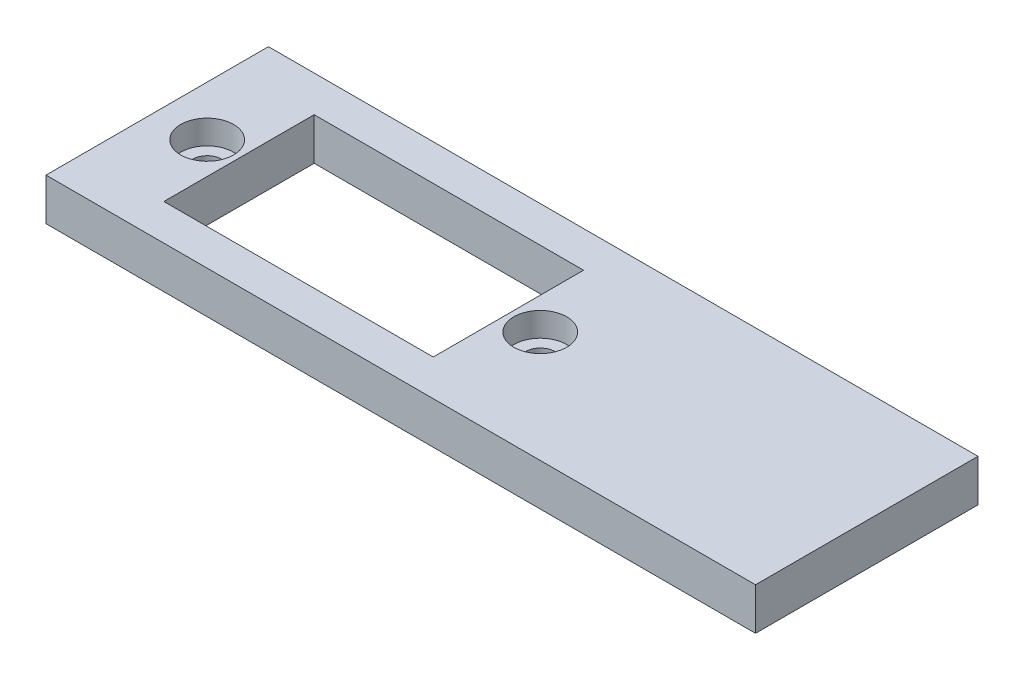
ISO-10303-21;
HEADER;
FILE_DESCRIPTION(('STEP AP214'),'2;1');
FILE_NAME('part.step','',(''),(''),'','','');
FILE_SCHEMA(('AUTOMOTIVE_DESIGN { 1 0 10303 214 1 1 1 1 }'));
ENDSEC;
DATA;
#1=APPLICATION_CONTEXT('core data for automotive mechanical design processes');
#2=APPLICATION_PROTOCOL_DEFINITION('international standard','automotive_design',2000,#1);
#3=PRODUCT_CONTEXT('',#1,'mechanical');
#4=PRODUCT('Part','Part','',(#3));
#5=PRODUCT_RELATED_PRODUCT_CATEGORY('part','',(#4));
#6=PRODUCT_DEFINITION_FORMATION('','',#4);
#7=PRODUCT_DEFINITION_CONTEXT('part definition',#1,'design');
#8=PRODUCT_DEFINITION('design','',#6,#7);
#9=PRODUCT_DEFINITION_SHAPE('','',#8);
#10=(LENGTH_UNIT() NAMED_UNIT(*) SI_UNIT(.MILLI.,.METRE.));
#11=(NAMED_UNIT(*) PLANE_ANGLE_UNIT() SI_UNIT($,.RADIAN.));
#12=(NAMED_UNIT(*) SI_UNIT($,.STERADIAN.) SOLID_ANGLE_UNIT());
#13=UNCERTAINTY_MEASURE_WITH_UNIT(LENGTH_MEASURE(1.E-05),#10,'distance_accuracy_value','');
#14=(GEOMETRIC_REPRESENTATION_CONTEXT(3) GLOBAL_UNCERTAINTY_ASSIGNED_CONTEXT((#13)) GLOBAL_UNIT_ASSIGNED_CONTEXT((#10,
#11,#12)) REPRESENTATION_CONTEXT('',''));
#15=CARTESIAN_POINT('',(0.,0.,0.));
#16=DIRECTION('',(0.,0.,1.));
#17=DIRECTION('',(1.,0.,0.));
#18=AXIS2_PLACEMENT_3D('',#15,#16,#17);
#19=CARTESIAN_POINT('',(0.,3.5,0.));
#20=DIRECTION('',(0.,-1.,0.));
#21=DIRECTION('',(0.,0.,-1.));
#22=AXIS2_PLACEMENT_3D('',#19,#20,#21);
#23=PLANE('',#22);
#24=CARTESIAN_POINT('',(-31.85,3.5,0.));
#25=DIRECTION('',(0.,1.,0.));
#26=DIRECTION('',(0.,0.,1.));
#27=AXIS2_PLACEMENT_3D('',#24,#25,#26);
#28=CIRCLE('',#27,2.19999999999999);
#29=CARTESIAN_POINT('',(-31.85,3.5,2.19999999999999));
#30=VERTEX_POINT('',#29);
#31=EDGE_CURVE('E248',#30,#30,#28,.T.);
#32=ORIENTED_EDGE('',*,*,#31,.F.);
#33=EDGE_LOOP('',(#32));
#34=FACE_BOUND('',#33,.T.);
#35=DIRECTION('',(0.,0.,-1.));
#36=VECTOR('',#35,1.);
#37=CARTESIAN_POINT('',(23.,3.5,9.25));
#38=LINE('',#37,#36);
#39=CARTESIAN_POINT('',(23.,3.5,9.25));
#40=VERTEX_POINT('',#39);
#41=CARTESIAN_POINT('',(23.,3.5,-9.25));
#42=VERTEX_POINT('',#41);
#43=EDGE_CURVE('E139',#40,#42,#38,.T.);
#44=ORIENTED_EDGE('',*,*,#43,.T.);
#45=DIRECTION('',(-1.,0.,0.));
#46=VECTOR('',#45,1.);
#47=CARTESIAN_POINT('',(0.,3.5,-9.25));
#48=LINE('',#47,#46);
#49=CARTESIAN_POINT('',(-36.,3.5,-9.25));
#50=VERTEX_POINT('',#49);
#51=EDGE_CURVE('E142',#42,#50,#48,.T.);
#52=ORIENTED_EDGE('',*,*,#51,.T.);
#53=DIRECTION('',(0.,0.,1.));
#54=VECTOR('',#53,1.);
#55=CARTESIAN_POINT('',(-36.,3.5,9.25));
#56=LINE('',#55,#54);
#57=CARTESIAN_POINT('',(-36.,3.5,9.25));
#58=VERTEX_POINT('',#57);
#59=EDGE_CURVE('E145',#50,#58,#56,.T.);
#60=ORIENTED_EDGE('',*,*,#59,.T.);
#61=DIRECTION('',(1.,0.,0.));
#62=VECTOR('',#61,1.);
#63=CARTESIAN_POINT('',(-36.,3.5,9.25));
#64=LINE('',#63,#62);
#65=EDGE_CURVE('E147',#58,#40,#64,.T.);
#66=ORIENTED_EDGE('',*,*,#65,.T.);
#67=EDGE_LOOP('',(#44,#52,#60,#66));
#68=FACE_BOUND('',#67,.T.);
#69=DIRECTION('',(0.,0.,1.));
#70=VECTOR('',#69,1.);
#71=CARTESIAN_POINT('',(-29.2,3.5,-6.25));
#72=LINE('',#71,#70);
#73=CARTESIAN_POINT('',(-29.2,3.5,-6.25));
#74=VERTEX_POINT('',#73);
#75=CARTESIAN_POINT('',(-29.2,3.5,6.25));
#76=VERTEX_POINT('',#75);
#77=EDGE_CURVE('E100',#74,#76,#72,.T.);
#78=ORIENTED_EDGE('',*,*,#77,.F.);
#79=DIRECTION('',(-1.,0.,0.));
#80=VECTOR('',#79,1.);
#81=CARTESIAN_POINT('',(-6.8,3.5,-6.25));
#82=LINE('',#81,#80);
#83=CARTESIAN_POINT('',(-6.8,3.5,-6.25));
#84=VERTEX_POINT('',#83);
#85=EDGE_CURVE('E123',#84,#74,#82,.T.);
#86=ORIENTED_EDGE('',*,*,#85,.F.);
#87=DIRECTION('',(0.,0.,-1.));
#88=VECTOR('',#87,1.);
#89=CARTESIAN_POINT('',(-6.8,3.5,-6.25));
#90=LINE('',#89,#88);
#91=CARTESIAN_POINT('',(-6.79999999999999,3.5,6.25));
#92=VERTEX_POINT('',#91);
#93=EDGE_CURVE('E121',#92,#84,#90,.T.);
#94=ORIENTED_EDGE('',*,*,#93,.F.);
#95=DIRECTION('',(1.,0.,0.));
#96=VECTOR('',#95,1.);
#97=CARTESIAN_POINT('',(-6.79999999999999,3.5,6.25));
#98=LINE('',#97,#96);
#99=EDGE_CURVE('E108',#76,#92,#98,.T.);
#100=ORIENTED_EDGE('',*,*,#99,.F.);
#101=EDGE_LOOP('',(#78,#86,#94,#100));
#102=FACE_BOUND('',#101,.T.);
#103=CARTESIAN_POINT('',(-4.15,3.5,0.));
#104=DIRECTION('',(0.,1.,0.));
#105=DIRECTION('',(0.,0.,1.));
#106=AXIS2_PLACEMENT_3D('',#103,#104,#105);
#107=CIRCLE('',#106,2.19999999999999);
#108=CARTESIAN_POINT('',(-4.15,3.5,2.19999999999999));
#109=VERTEX_POINT('',#108);
#110=EDGE_CURVE('E258',#109,#109,#107,.T.);
#111=ORIENTED_EDGE('',*,*,#110,.F.);
#112=EDGE_LOOP('',(#111));
#113=FACE_BOUND('',#112,.T.);
#114=ADVANCED_FACE('F35',(#34,#68,#102,#113),#23,.F.);
#115=CARTESIAN_POINT('',(0.,0.,0.));
#116=DIRECTION('',(0.,-1.,0.));
#117=DIRECTION('',(0.,0.,-1.));
#118=AXIS2_PLACEMENT_3D('',#115,#116,#117);
#119=PLANE('',#118);
#120=CARTESIAN_POINT('',(-31.85,0.,0.));
#121=DIRECTION('',(0.,-1.,0.));
#122=DIRECTION('',(0.,0.,-1.));
#123=AXIS2_PLACEMENT_3D('',#120,#121,#122);
#124=CIRCLE('',#123,1.20000000000001);
#125=CARTESIAN_POINT('',(-31.85,0.,-1.20000000000001));
#126=VERTEX_POINT('',#125);
#127=EDGE_CURVE('E255',#126,#126,#124,.T.);
#128=ORIENTED_EDGE('',*,*,#127,.F.);
#129=EDGE_LOOP('',(#128));
#130=FACE_BOUND('',#129,.T.);
#131=CARTESIAN_POINT('',(-4.15,0.,0.));
#132=DIRECTION('',(0.,-1.,0.));
#133=DIRECTION('',(0.,0.,-1.));
#134=AXIS2_PLACEMENT_3D('',#131,#132,#133);
#135=CIRCLE('',#134,1.20000000000001);
#136=CARTESIAN_POINT('',(-4.15,0.,-1.20000000000001));
#137=VERTEX_POINT('',#136);
#138=EDGE_CURVE('E129',#137,#137,#135,.T.);
#139=ORIENTED_EDGE('',*,*,#138,.F.);
#140=EDGE_LOOP('',(#139));
#141=FACE_BOUND('',#140,.T.);
#142=DIRECTION('',(0.,0.,-1.));
#143=VECTOR('',#142,1.);
#144=CARTESIAN_POINT('',(23.,0.,9.25));
#145=LINE('',#144,#143);
#146=CARTESIAN_POINT('',(23.,0.,9.25));
#147=VERTEX_POINT('',#146);
#148=CARTESIAN_POINT('',(23.,0.,-9.25));
#149=VERTEX_POINT('',#148);
#150=EDGE_CURVE('E116',#147,#149,#145,.T.);
#151=ORIENTED_EDGE('',*,*,#150,.F.);
#152=DIRECTION('',(1.,0.,0.));
#153=VECTOR('',#152,1.);
#154=CARTESIAN_POINT('',(0.,0.,9.25));
#155=LINE('',#154,#153);
#156=CARTESIAN_POINT('',(-36.,0.,9.25));
#157=VERTEX_POINT('',#156);
#158=EDGE_CURVE('E143',#157,#147,#155,.T.);
#159=ORIENTED_EDGE('',*,*,#158,.F.);
#160=DIRECTION('',(0.,0.,1.));
#161=VECTOR('',#160,1.);
#162=CARTESIAN_POINT('',(-36.,0.,9.25));
#163=LINE('',#162,#161);
#164=CARTESIAN_POINT('',(-36.,0.,-9.25));
#165=VERTEX_POINT('',#164);
#166=EDGE_CURVE('E154',#165,#157,#163,.T.);
#167=ORIENTED_EDGE('',*,*,#166,.F.);
#168=DIRECTION('',(-1.,0.,0.));
#169=VECTOR('',#168,1.);
#170=CARTESIAN_POINT('',(-36.,0.,-9.25));
#171=LINE('',#170,#169);
#172=EDGE_CURVE('E152',#149,#165,#171,.T.);
#173=ORIENTED_EDGE('',*,*,#172,.F.);
#174=EDGE_LOOP('',(#151,#159,#167,#173));
#175=FACE_BOUND('',#174,.T.);
#176=DIRECTION('',(-1.,0.,0.));
#177=VECTOR('',#176,1.);
#178=CARTESIAN_POINT('',(-6.8,0.,-6.25));
#179=LINE('',#178,#177);
#180=CARTESIAN_POINT('',(-6.8,0.,-6.25));
#181=VERTEX_POINT('',#180);
#182=CARTESIAN_POINT('',(-29.2,0.,-6.25));
#183=VERTEX_POINT('',#182);
#184=EDGE_CURVE('E109',#181,#183,#179,.T.);
#185=ORIENTED_EDGE('',*,*,#184,.T.);
#186=DIRECTION('',(0.,0.,1.));
#187=VECTOR('',#186,1.);
#188=CARTESIAN_POINT('',(-29.2,0.,-6.25));
#189=LINE('',#188,#187);
#190=CARTESIAN_POINT('',(-29.2,0.,6.25));
#191=VERTEX_POINT('',#190);
#192=EDGE_CURVE('E58',#183,#191,#189,.T.);
#193=ORIENTED_EDGE('',*,*,#192,.T.);
#194=DIRECTION('',(1.,0.,0.));
#195=VECTOR('',#194,1.);
#196=CARTESIAN_POINT('',(-6.79999999999999,0.,6.25));
#197=LINE('',#196,#195);
#198=CARTESIAN_POINT('',(-6.79999999999999,0.,6.25));
#199=VERTEX_POINT('',#198);
#200=EDGE_CURVE('E115',#191,#199,#197,.T.);
#201=ORIENTED_EDGE('',*,*,#200,.T.);
#202=DIRECTION('',(0.,0.,-1.));
#203=VECTOR('',#202,1.);
#204=CARTESIAN_POINT('',(-6.8,0.,-6.25));
#205=LINE('',#204,#203);
#206=EDGE_CURVE('E131',#199,#181,#205,.T.);
#207=ORIENTED_EDGE('',*,*,#206,.T.);
#208=EDGE_LOOP('',(#185,#193,#201,#207));
#209=FACE_BOUND('',#208,.T.);
#210=ADVANCED_FACE('F172',(#130,#141,#175,#209),#119,.T.);
#211=CARTESIAN_POINT('',(23.,3.5,9.25));
#212=DIRECTION('',(-1.,0.,0.));
#213=DIRECTION('',(0.,0.,1.));
#214=AXIS2_PLACEMENT_3D('',#211,#212,#213);
#215=PLANE('',#214);
#216=ORIENTED_EDGE('',*,*,#150,.T.);
#217=DIRECTION('',(0.,-1.,0.));
#218=VECTOR('',#217,1.);
#219=CARTESIAN_POINT('',(23.,3.5,-9.25));
#220=LINE('',#219,#218);
#221=EDGE_CURVE('E11',#42,#149,#220,.T.);
#222=ORIENTED_EDGE('',*,*,#221,.F.);
#223=ORIENTED_EDGE('',*,*,#43,.F.);
#224=DIRECTION('',(0.,-1.,0.));
#225=VECTOR('',#224,1.);
#226=CARTESIAN_POINT('',(23.,3.5,9.25));
#227=LINE('',#226,#225);
#228=EDGE_CURVE('E149',#40,#147,#227,.T.);
#229=ORIENTED_EDGE('',*,*,#228,.T.);
#230=EDGE_LOOP('',(#216,#222,#223,#229));
#231=FACE_BOUND('',#230,.T.);
#232=ADVANCED_FACE('F37',(#231),#215,.F.);
#233=CARTESIAN_POINT('',(-36.,3.5,-9.25));
#234=DIRECTION('',(0.,0.,1.));
#235=DIRECTION('',(1.,0.,0.));
#236=AXIS2_PLACEMENT_3D('',#233,#234,#235);
#237=PLANE('',#236);
#238=ORIENTED_EDGE('',*,*,#172,.T.);
#239=DIRECTION('',(0.,-1.,0.));
#240=VECTOR('',#239,1.);
#241=CARTESIAN_POINT('',(-36.,3.5,-9.25));
#242=LINE('',#241,#240);
#243=EDGE_CURVE('E43',#50,#165,#242,.T.);
#244=ORIENTED_EDGE('',*,*,#243,.F.);
#245=ORIENTED_EDGE('',*,*,#51,.F.);
#246=ORIENTED_EDGE('',*,*,#221,.T.);
#247=EDGE_LOOP('',(#238,#244,#245,#246));
#248=FACE_BOUND('',#247,.T.);
#249=ADVANCED_FACE('F182',(#248),#237,.F.);
#250=CARTESIAN_POINT('',(-36.,3.5,9.25));
#251=DIRECTION('',(1.,0.,0.));
#252=DIRECTION('',(0.,0.,-1.));
#253=AXIS2_PLACEMENT_3D('',#250,#251,#252);
#254=PLANE('',#253);
#255=ORIENTED_EDGE('',*,*,#166,.T.);
#256=DIRECTION('',(0.,-1.,0.));
#257=VECTOR('',#256,1.);
#258=CARTESIAN_POINT('',(-36.,3.5,9.25));
#259=LINE('',#258,#257);
#260=EDGE_CURVE('E160',#58,#157,#259,.T.);
#261=ORIENTED_EDGE('',*,*,#260,.F.);
#262=ORIENTED_EDGE('',*,*,#59,.F.);
#263=ORIENTED_EDGE('',*,*,#243,.T.);
#264=EDGE_LOOP('',(#255,#261,#262,#263));
#265=FACE_BOUND('',#264,.T.);
#266=ADVANCED_FACE('F167',(#265),#254,.F.);
#267=CARTESIAN_POINT('',(0.,3.5,9.25));
#268=DIRECTION('',(0.,0.,-1.));
#269=DIRECTION('',(-1.,0.,0.));
#270=AXIS2_PLACEMENT_3D('',#267,#268,#269);
#271=PLANE('',#270);
#272=ORIENTED_EDGE('',*,*,#158,.T.);
#273=ORIENTED_EDGE('',*,*,#228,.F.);
#274=ORIENTED_EDGE('',*,*,#65,.F.);
#275=ORIENTED_EDGE('',*,*,#260,.T.);
#276=EDGE_LOOP('',(#272,#273,#274,#275));
#277=FACE_BOUND('',#276,.T.);
#278=ADVANCED_FACE('F176',(#277),#271,.F.);
#279=CARTESIAN_POINT('',(-29.2,3.5,-6.25));
#280=DIRECTION('',(1.,0.,0.));
#281=DIRECTION('',(0.,0.,-1.));
#282=AXIS2_PLACEMENT_3D('',#279,#280,#281);
#283=PLANE('',#282);
#284=ORIENTED_EDGE('',*,*,#192,.F.);
#285=DIRECTION('',(0.,-1.,0.));
#286=VECTOR('',#285,1.);
#287=CARTESIAN_POINT('',(-29.2,3.5,-6.25));
#288=LINE('',#287,#286);
#289=EDGE_CURVE('E104',#74,#183,#288,.T.);
#290=ORIENTED_EDGE('',*,*,#289,.F.);
#291=ORIENTED_EDGE('',*,*,#77,.T.);
#292=DIRECTION('',(0.,-1.,0.));
#293=VECTOR('',#292,1.);
#294=CARTESIAN_POINT('',(-29.2,3.5,6.25));
#295=LINE('',#294,#293);
#296=EDGE_CURVE('E103',#76,#191,#295,.T.);
#297=ORIENTED_EDGE('',*,*,#296,.T.);
#298=EDGE_LOOP('',(#284,#290,#291,#297));
#299=FACE_BOUND('',#298,.T.);
#300=ADVANCED_FACE('F102',(#299),#283,.T.);
#301=CARTESIAN_POINT('',(-6.79999999999999,3.5,6.25));
#302=DIRECTION('',(0.,0.,-1.));
#303=DIRECTION('',(-1.,0.,0.));
#304=AXIS2_PLACEMENT_3D('',#301,#302,#303);
#305=PLANE('',#304);
#306=ORIENTED_EDGE('',*,*,#200,.F.);
#307=ORIENTED_EDGE('',*,*,#296,.F.);
#308=ORIENTED_EDGE('',*,*,#99,.T.);
#309=DIRECTION('',(0.,-1.,0.));
#310=VECTOR('',#309,1.);
#311=CARTESIAN_POINT('',(-6.79999999999999,3.5,6.25));
#312=LINE('',#311,#310);
#313=EDGE_CURVE('E117',#92,#199,#312,.T.);
#314=ORIENTED_EDGE('',*,*,#313,.T.);
#315=EDGE_LOOP('',(#306,#307,#308,#314));
#316=FACE_BOUND('',#315,.T.);
#317=ADVANCED_FACE('F112',(#316),#305,.T.);
#318=CARTESIAN_POINT('',(-6.8,3.5,-6.25));
#319=DIRECTION('',(-1.,0.,0.));
#320=DIRECTION('',(0.,0.,1.));
#321=AXIS2_PLACEMENT_3D('',#318,#319,#320);
#322=PLANE('',#321);
#323=ORIENTED_EDGE('',*,*,#206,.F.);
#324=ORIENTED_EDGE('',*,*,#313,.F.);
#325=ORIENTED_EDGE('',*,*,#93,.T.);
#326=DIRECTION('',(0.,-1.,0.));
#327=VECTOR('',#326,1.);
#328=CARTESIAN_POINT('',(-6.8,3.5,-6.25));
#329=LINE('',#328,#327);
#330=EDGE_CURVE('E50',#84,#181,#329,.T.);
#331=ORIENTED_EDGE('',*,*,#330,.T.);
#332=EDGE_LOOP('',(#323,#324,#325,#331));
#333=FACE_BOUND('',#332,.T.);
#334=ADVANCED_FACE('F208',(#333),#322,.T.);
#335=CARTESIAN_POINT('',(-6.8,3.5,-6.25));
#336=DIRECTION('',(0.,0.,1.));
#337=DIRECTION('',(1.,0.,0.));
#338=AXIS2_PLACEMENT_3D('',#335,#336,#337);
#339=PLANE('',#338);
#340=ORIENTED_EDGE('',*,*,#184,.F.);
#341=ORIENTED_EDGE('',*,*,#330,.F.);
#342=ORIENTED_EDGE('',*,*,#85,.T.);
#343=ORIENTED_EDGE('',*,*,#289,.T.);
#344=EDGE_LOOP('',(#340,#341,#342,#343));
#345=FACE_BOUND('',#344,.T.);
#346=ADVANCED_FACE('F212',(#345),#339,.T.);
#347=CARTESIAN_POINT('',(-4.15,3.5,0.));
#348=DIRECTION('',(0.,1.,0.));
#349=DIRECTION('',(0.,0.,1.));
#350=AXIS2_PLACEMENT_3D('',#347,#348,#349);
#351=CYLINDRICAL_SURFACE('',#350,1.20000000000001);
#352=CARTESIAN_POINT('',(-4.15,1.5,0.));
#353=DIRECTION('',(0.,1.,0.));
#354=DIRECTION('',(0.,0.,1.));
#355=AXIS2_PLACEMENT_3D('',#352,#353,#354);
#356=CIRCLE('',#355,1.20000000000001);
#357=CARTESIAN_POINT('',(-4.15,1.5,1.20000000000001));
#358=VERTEX_POINT('',#357);
#359=EDGE_CURVE('E264',#358,#358,#356,.T.);
#360=ORIENTED_EDGE('',*,*,#359,.T.);
#361=EDGE_LOOP('',(#360));
#362=FACE_BOUND('',#361,.T.);
#363=ORIENTED_EDGE('',*,*,#138,.T.);
#364=EDGE_LOOP('',(#363));
#365=FACE_BOUND('',#364,.T.);
#366=ADVANCED_FACE('F218',(#362,#365),#351,.F.);
#367=CARTESIAN_POINT('',(-2.94999999999998,1.5,0.));
#368=DIRECTION('',(0.,-1.,0.));
#369=DIRECTION('',(0.,0.,-1.));
#370=AXIS2_PLACEMENT_3D('',#367,#368,#369);
#371=PLANE('',#370);
#372=ORIENTED_EDGE('',*,*,#359,.F.);
#373=EDGE_LOOP('',(#372));
#374=FACE_BOUND('',#373,.T.);
#375=CARTESIAN_POINT('',(-4.15,1.5,0.));
#376=DIRECTION('',(0.,1.,0.));
#377=DIRECTION('',(0.,0.,1.));
#378=AXIS2_PLACEMENT_3D('',#375,#376,#377);
#379=CIRCLE('',#378,2.19999999999999);
#380=CARTESIAN_POINT('',(-4.15,1.5,2.19999999999999));
#381=VERTEX_POINT('',#380);
#382=EDGE_CURVE('E261',#381,#381,#379,.T.);
#383=ORIENTED_EDGE('',*,*,#382,.T.);
#384=EDGE_LOOP('',(#383));
#385=FACE_BOUND('',#384,.T.);
#386=ADVANCED_FACE('F221',(#374,#385),#371,.F.);
#387=CARTESIAN_POINT('',(-4.15,3.5,0.));
#388=DIRECTION('',(0.,1.,0.));
#389=DIRECTION('',(0.,0.,1.));
#390=AXIS2_PLACEMENT_3D('',#387,#388,#389);
#391=CYLINDRICAL_SURFACE('',#390,2.19999999999999);
#392=ORIENTED_EDGE('',*,*,#382,.F.);
#393=EDGE_LOOP('',(#392));
#394=FACE_BOUND('',#393,.T.);
#395=ORIENTED_EDGE('',*,*,#110,.T.);
#396=EDGE_LOOP('',(#395));
#397=FACE_BOUND('',#396,.T.);
#398=ADVANCED_FACE('F225',(#394,#397),#391,.F.);
#399=CARTESIAN_POINT('',(-31.85,3.5,0.));
#400=DIRECTION('',(0.,1.,0.));
#401=DIRECTION('',(0.,0.,1.));
#402=AXIS2_PLACEMENT_3D('',#399,#400,#401);
#403=CYLINDRICAL_SURFACE('',#402,1.20000000000001);
#404=CARTESIAN_POINT('',(-31.85,1.5,0.));
#405=DIRECTION('',(0.,1.,0.));
#406=DIRECTION('',(0.,0.,1.));
#407=AXIS2_PLACEMENT_3D('',#404,#405,#406);
#408=CIRCLE('',#407,1.20000000000001);
#409=CARTESIAN_POINT('',(-31.85,1.5,1.20000000000001));
#410=VERTEX_POINT('',#409);
#411=EDGE_CURVE('E250',#410,#410,#408,.T.);
#412=ORIENTED_EDGE('',*,*,#411,.T.);
#413=EDGE_LOOP('',(#412));
#414=FACE_BOUND('',#413,.T.);
#415=ORIENTED_EDGE('',*,*,#127,.T.);
#416=EDGE_LOOP('',(#415));
#417=FACE_BOUND('',#416,.T.);
#418=ADVANCED_FACE('F229',(#414,#417),#403,.F.);
#419=CARTESIAN_POINT('',(-30.65,1.5,0.));
#420=DIRECTION('',(0.,-1.,0.));
#421=DIRECTION('',(0.,0.,-1.));
#422=AXIS2_PLACEMENT_3D('',#419,#420,#421);
#423=PLANE('',#422);
#424=ORIENTED_EDGE('',*,*,#411,.F.);
#425=EDGE_LOOP('',(#424));
#426=FACE_BOUND('',#425,.T.);
#427=CARTESIAN_POINT('',(-31.85,1.5,0.));
#428=DIRECTION('',(0.,1.,0.));
#429=DIRECTION('',(0.,0.,1.));
#430=AXIS2_PLACEMENT_3D('',#427,#428,#429);
#431=CIRCLE('',#430,2.19999999999999);
#432=CARTESIAN_POINT('',(-31.85,1.5,2.19999999999999));
#433=VERTEX_POINT('',#432);
#434=EDGE_CURVE('E246',#433,#433,#431,.T.);
#435=ORIENTED_EDGE('',*,*,#434,.T.);
#436=EDGE_LOOP('',(#435));
#437=FACE_BOUND('',#436,.T.);
#438=ADVANCED_FACE('F233',(#426,#437),#423,.F.);
#439=CARTESIAN_POINT('',(-31.85,3.5,0.));
#440=DIRECTION('',(0.,1.,0.));
#441=DIRECTION('',(0.,0.,1.));
#442=AXIS2_PLACEMENT_3D('',#439,#440,#441);
#443=CYLINDRICAL_SURFACE('',#442,2.19999999999999);
#444=ORIENTED_EDGE('',*,*,#434,.F.);
#445=EDGE_LOOP('',(#444));
#446=FACE_BOUND('',#445,.T.);
#447=ORIENTED_EDGE('',*,*,#31,.T.);
#448=EDGE_LOOP('',(#447));
#449=FACE_BOUND('',#448,.T.);
#450=ADVANCED_FACE('F237',(#446,#449),#443,.F.);
#451=CLOSED_SHELL('',(#114,#210,#232,#249,#266,#278,#300,#317,#334,#346,#366,#386,#398,#418,
#438,#450));
#452=MANIFOLD_SOLID_BREP('B2',#451);
#453=ADVANCED_BREP_SHAPE_REPRESENTATION('',(#18,#452),#14);
#454=SHAPE_DEFINITION_REPRESENTATION(#9,#453);
ENDSEC;
END-ISO-10303-21;
